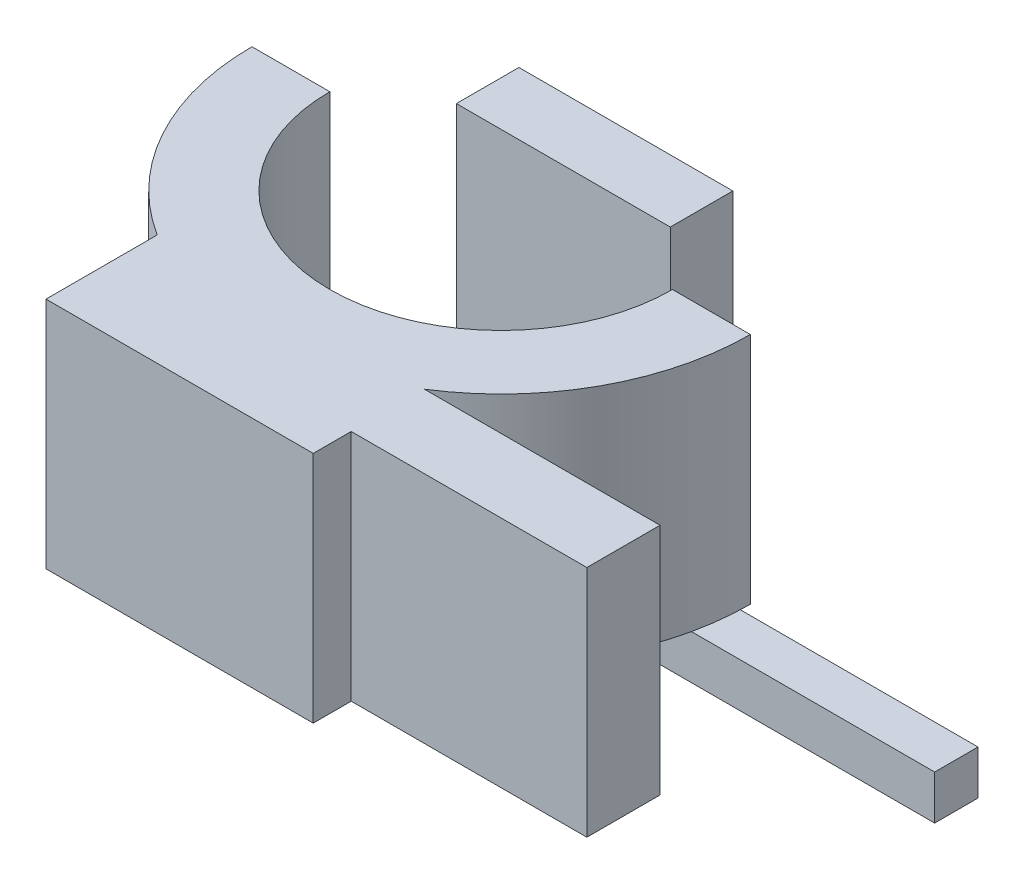
ISO-10303-21;
HEADER;
FILE_DESCRIPTION(('STEP AP214'),'2;1');
FILE_NAME('part.step','',(''),(''),'','','');
FILE_SCHEMA(('AUTOMOTIVE_DESIGN { 1 0 10303 214 1 1 1 1 }'));
ENDSEC;
DATA;
#1=APPLICATION_CONTEXT('core data for automotive mechanical design processes');
#2=APPLICATION_PROTOCOL_DEFINITION('international standard','automotive_design',2000,#1);
#3=PRODUCT_CONTEXT('',#1,'mechanical');
#4=PRODUCT('Part','Part','',(#3));
#5=PRODUCT_RELATED_PRODUCT_CATEGORY('part','',(#4));
#6=PRODUCT_DEFINITION_FORMATION('','',#4);
#7=PRODUCT_DEFINITION_CONTEXT('part definition',#1,'design');
#8=PRODUCT_DEFINITION('design','',#6,#7);
#9=PRODUCT_DEFINITION_SHAPE('','',#8);
#10=(LENGTH_UNIT() NAMED_UNIT(*) SI_UNIT(.MILLI.,.METRE.));
#11=(NAMED_UNIT(*) PLANE_ANGLE_UNIT() SI_UNIT($,.RADIAN.));
#12=(NAMED_UNIT(*) SI_UNIT($,.STERADIAN.) SOLID_ANGLE_UNIT());
#13=UNCERTAINTY_MEASURE_WITH_UNIT(LENGTH_MEASURE(1.E-05),#10,'distance_accuracy_value','');
#14=(GEOMETRIC_REPRESENTATION_CONTEXT(3) GLOBAL_UNCERTAINTY_ASSIGNED_CONTEXT((#13)) GLOBAL_UNIT_ASSIGNED_CONTEXT((#10,
#11,#12)) REPRESENTATION_CONTEXT('',''));
#15=CARTESIAN_POINT('',(0.,0.,0.));
#16=DIRECTION('',(0.,0.,1.));
#17=DIRECTION('',(1.,0.,0.));
#18=AXIS2_PLACEMENT_3D('',#15,#16,#17);
#19=CARTESIAN_POINT('',(2.77347256122325,-25.,-13.4602015658665));
#20=DIRECTION('',(-1.,0.,0.));
#21=DIRECTION('',(0.,0.,1.));
#22=AXIS2_PLACEMENT_3D('',#19,#20,#21);
#23=PLANE('',#22);
#24=DIRECTION('',(0.,0.,1.));
#25=VECTOR('',#24,1.);
#26=CARTESIAN_POINT('',(2.77347256122325,-19.3172173021132,-7.89287750827361));
#27=LINE('',#26,#25);
#28=CARTESIAN_POINT('',(2.77347256122325,-19.3172173021132,-13.4602015658665));
#29=VERTEX_POINT('',#28);
#30=CARTESIAN_POINT('',(2.77347256122325,-19.3172173021132,-7.89287750827361));
#31=VERTEX_POINT('',#30);
#32=EDGE_CURVE('E164',#29,#31,#27,.T.);
#33=ORIENTED_EDGE('',*,*,#32,.F.);
#34=DIRECTION('',(0.,1.,0.));
#35=VECTOR('',#34,1.);
#36=CARTESIAN_POINT('',(2.77347256122325,-25.,-13.4602015658665));
#37=LINE('',#36,#35);
#38=CARTESIAN_POINT('',(2.77347256122325,0.,-13.4602015658665));
#39=VERTEX_POINT('',#38);
#40=EDGE_CURVE('E177',#29,#39,#37,.T.);
#41=ORIENTED_EDGE('',*,*,#40,.T.);
#42=DIRECTION('',(0.,0.,1.));
#43=VECTOR('',#42,1.);
#44=CARTESIAN_POINT('',(2.77347256122325,0.,-13.4602015658665));
#45=LINE('',#44,#43);
#46=CARTESIAN_POINT('',(2.77347256122325,0.,-7.89287750827361));
#47=VERTEX_POINT('',#46);
#48=EDGE_CURVE('E173',#39,#47,#45,.T.);
#49=ORIENTED_EDGE('',*,*,#48,.T.);
#50=DIRECTION('',(0.,1.,0.));
#51=VECTOR('',#50,1.);
#52=CARTESIAN_POINT('',(2.77347256122325,-25.,-7.89287750827361));
#53=LINE('',#52,#51);
#54=EDGE_CURVE('E188',#31,#47,#53,.T.);
#55=ORIENTED_EDGE('',*,*,#54,.F.);
#56=EDGE_LOOP('',(#33,#41,#49,#55));
#57=FACE_BOUND('',#56,.T.);
#58=ADVANCED_FACE('F51',(#57),#23,.F.);
#59=CARTESIAN_POINT('',(0.,0.,0.));
#60=DIRECTION('',(0.,-1.,0.));
#61=DIRECTION('',(0.,0.,-1.));
#62=AXIS2_PLACEMENT_3D('',#59,#60,#61);
#63=PLANE('',#62);
#64=DIRECTION('',(1.,0.,0.));
#65=VECTOR('',#64,1.);
#66=CARTESIAN_POINT('',(14.910109148464,0.,-6.80646520609152));
#67=LINE('',#66,#65);
#68=CARTESIAN_POINT('',(-12.5555390868133,0.,-6.80646520609152));
#69=VERTEX_POINT('',#68);
#70=CARTESIAN_POINT('',(14.910109148464,0.,-6.80646520609152));
#71=VERTEX_POINT('',#70);
#72=EDGE_CURVE('E190',#69,#71,#67,.T.);
#73=ORIENTED_EDGE('',*,*,#72,.F.);
#74=DIRECTION('',(0.,0.,1.));
#75=VECTOR('',#74,1.);
#76=CARTESIAN_POINT('',(-12.5555390868133,0.,-6.80646520609152));
#77=LINE('',#76,#75);
#78=CARTESIAN_POINT('',(-12.5555390868133,0.,-14.8361542246356));
#79=VERTEX_POINT('',#78);
#80=EDGE_CURVE('E96',#79,#69,#77,.T.);
#81=ORIENTED_EDGE('',*,*,#80,.F.);
#82=DIRECTION('',(-1.,0.,0.));
#83=VECTOR('',#82,1.);
#84=CARTESIAN_POINT('',(-12.5555390868133,0.,-14.8361542246356));
#85=LINE('',#84,#83);
#86=CARTESIAN_POINT('',(14.910109148464,0.,-14.8361542246356));
#87=VERTEX_POINT('',#86);
#88=EDGE_CURVE('E202',#87,#79,#85,.T.);
#89=ORIENTED_EDGE('',*,*,#88,.F.);
#90=DIRECTION('',(0.,0.,-1.));
#91=VECTOR('',#90,1.);
#92=CARTESIAN_POINT('',(14.910109148464,0.,-14.8361542246356));
#93=LINE('',#92,#91);
#94=EDGE_CURVE('E200',#71,#87,#93,.T.);
#95=ORIENTED_EDGE('',*,*,#94,.F.);
#96=EDGE_LOOP('',(#73,#81,#89,#95));
#97=FACE_BOUND('',#96,.T.);
#98=DIRECTION('',(-1.,0.,0.));
#99=VECTOR('',#98,1.);
#100=CARTESIAN_POINT('',(2.77347256122325,0.,-7.89287750827361));
#101=LINE('',#100,#99);
#102=CARTESIAN_POINT('',(-2.04171345011078,0.,-7.89287750827361));
#103=VERTEX_POINT('',#102);
#104=EDGE_CURVE('E180',#47,#103,#101,.T.);
#105=ORIENTED_EDGE('',*,*,#104,.F.);
#106=ORIENTED_EDGE('',*,*,#48,.F.);
#107=DIRECTION('',(1.,0.,0.));
#108=VECTOR('',#107,1.);
#109=CARTESIAN_POINT('',(2.77347256122325,0.,-13.4602015658665));
#110=LINE('',#109,#108);
#111=CARTESIAN_POINT('',(-2.04171345011078,0.,-13.4602015658665));
#112=VERTEX_POINT('',#111);
#113=EDGE_CURVE('E150',#112,#39,#110,.T.);
#114=ORIENTED_EDGE('',*,*,#113,.F.);
#115=DIRECTION('',(0.,0.,-1.));
#116=VECTOR('',#115,1.);
#117=CARTESIAN_POINT('',(-2.04171345011078,0.,-13.4602015658665));
#118=LINE('',#117,#116);
#119=EDGE_CURVE('E182',#103,#112,#118,.T.);
#120=ORIENTED_EDGE('',*,*,#119,.F.);
#121=EDGE_LOOP('',(#105,#106,#114,#120));
#122=FACE_BOUND('',#121,.T.);
#123=ADVANCED_FACE('F215',(#97,#122),#63,.T.);
#124=CARTESIAN_POINT('',(14.910109148464,25.4,-6.80646520609152));
#125=DIRECTION('',(0.,0.,-1.));
#126=DIRECTION('',(-1.,0.,0.));
#127=AXIS2_PLACEMENT_3D('',#124,#125,#126);
#128=PLANE('',#127);
#129=ORIENTED_EDGE('',*,*,#72,.T.);
#130=DIRECTION('',(0.,-1.,0.));
#131=VECTOR('',#130,1.);
#132=CARTESIAN_POINT('',(14.910109148464,25.4,-6.80646520609152));
#133=LINE('',#132,#131);
#134=CARTESIAN_POINT('',(14.910109148464,25.4,-6.80646520609152));
#135=VERTEX_POINT('',#134);
#136=EDGE_CURVE('E12',#135,#71,#133,.T.);
#137=ORIENTED_EDGE('',*,*,#136,.F.);
#138=DIRECTION('',(1.,0.,0.));
#139=VECTOR('',#138,1.);
#140=CARTESIAN_POINT('',(14.910109148464,25.4,-6.80646520609152));
#141=LINE('',#140,#139);
#142=CARTESIAN_POINT('',(-12.5555390868133,25.4,-6.80646520609152));
#143=VERTEX_POINT('',#142);
#144=EDGE_CURVE('E191',#143,#135,#141,.T.);
#145=ORIENTED_EDGE('',*,*,#144,.F.);
#146=DIRECTION('',(0.,-1.,0.));
#147=VECTOR('',#146,1.);
#148=CARTESIAN_POINT('',(-12.5555390868133,25.4,-6.80646520609152));
#149=LINE('',#148,#147);
#150=EDGE_CURVE('E197',#143,#69,#149,.T.);
#151=ORIENTED_EDGE('',*,*,#150,.T.);
#152=EDGE_LOOP('',(#129,#137,#145,#151));
#153=FACE_BOUND('',#152,.T.);
#154=ADVANCED_FACE('F53',(#153),#128,.F.);
#155=CARTESIAN_POINT('',(14.910109148464,25.4,-14.8361542246356));
#156=DIRECTION('',(-1.,0.,0.));
#157=DIRECTION('',(0.,0.,1.));
#158=AXIS2_PLACEMENT_3D('',#155,#156,#157);
#159=PLANE('',#158);
#160=ORIENTED_EDGE('',*,*,#94,.T.);
#161=DIRECTION('',(0.,-1.,0.));
#162=VECTOR('',#161,1.);
#163=CARTESIAN_POINT('',(14.910109148464,25.4,-14.8361542246356));
#164=LINE('',#163,#162);
#165=CARTESIAN_POINT('',(14.910109148464,25.4,-14.8361542246356));
#166=VERTEX_POINT('',#165);
#167=EDGE_CURVE('E59',#166,#87,#164,.T.);
#168=ORIENTED_EDGE('',*,*,#167,.F.);
#169=DIRECTION('',(0.,0.,-1.));
#170=VECTOR('',#169,1.);
#171=CARTESIAN_POINT('',(14.910109148464,25.4,-14.8361542246356));
#172=LINE('',#171,#170);
#173=EDGE_CURVE('E103',#135,#166,#172,.T.);
#174=ORIENTED_EDGE('',*,*,#173,.F.);
#175=ORIENTED_EDGE('',*,*,#136,.T.);
#176=EDGE_LOOP('',(#160,#168,#174,#175));
#177=FACE_BOUND('',#176,.T.);
#178=ADVANCED_FACE('F229',(#177),#159,.F.);
#179=CARTESIAN_POINT('',(-12.5555390868133,25.4,-14.8361542246356));
#180=DIRECTION('',(0.,0.,1.));
#181=DIRECTION('',(1.,0.,0.));
#182=AXIS2_PLACEMENT_3D('',#179,#180,#181);
#183=PLANE('',#182);
#184=ORIENTED_EDGE('',*,*,#88,.T.);
#185=DIRECTION('',(0.,-1.,0.));
#186=VECTOR('',#185,1.);
#187=CARTESIAN_POINT('',(-12.5555390868133,25.4,-14.8361542246356));
#188=LINE('',#187,#186);
#189=CARTESIAN_POINT('',(-12.5555390868133,25.4,-14.8361542246356));
#190=VERTEX_POINT('',#189);
#191=EDGE_CURVE('E206',#190,#79,#188,.T.);
#192=ORIENTED_EDGE('',*,*,#191,.F.);
#193=DIRECTION('',(-1.,0.,0.));
#194=VECTOR('',#193,1.);
#195=CARTESIAN_POINT('',(-12.5555390868133,25.4,-14.8361542246356));
#196=LINE('',#195,#194);
#197=EDGE_CURVE('E194',#166,#190,#196,.T.);
#198=ORIENTED_EDGE('',*,*,#197,.F.);
#199=ORIENTED_EDGE('',*,*,#167,.T.);
#200=EDGE_LOOP('',(#184,#192,#198,#199));
#201=FACE_BOUND('',#200,.T.);
#202=ADVANCED_FACE('F211',(#201),#183,.F.);
#203=CARTESIAN_POINT('',(-12.5555390868133,25.4,-6.80646520609152));
#204=DIRECTION('',(1.,0.,0.));
#205=DIRECTION('',(0.,0.,-1.));
#206=AXIS2_PLACEMENT_3D('',#203,#204,#205);
#207=PLANE('',#206);
#208=ORIENTED_EDGE('',*,*,#80,.T.);
#209=ORIENTED_EDGE('',*,*,#150,.F.);
#210=DIRECTION('',(0.,0.,1.));
#211=VECTOR('',#210,1.);
#212=CARTESIAN_POINT('',(-12.5555390868133,25.4,-6.80646520609152));
#213=LINE('',#212,#211);
#214=EDGE_CURVE('E75',#190,#143,#213,.T.);
#215=ORIENTED_EDGE('',*,*,#214,.F.);
#216=ORIENTED_EDGE('',*,*,#191,.T.);
#217=EDGE_LOOP('',(#208,#209,#215,#216));
#218=FACE_BOUND('',#217,.T.);
#219=ADVANCED_FACE('F220',(#218),#207,.F.);
#220=CARTESIAN_POINT('',(0.,25.4,0.));
#221=DIRECTION('',(0.,-1.,0.));
#222=DIRECTION('',(0.,0.,-1.));
#223=AXIS2_PLACEMENT_3D('',#220,#221,#222);
#224=PLANE('',#223);
#225=ORIENTED_EDGE('',*,*,#144,.T.);
#226=ORIENTED_EDGE('',*,*,#173,.T.);
#227=ORIENTED_EDGE('',*,*,#197,.T.);
#228=ORIENTED_EDGE('',*,*,#214,.T.);
#229=EDGE_LOOP('',(#225,#226,#227,#228));
#230=FACE_BOUND('',#229,.T.);
#231=ADVANCED_FACE('F222',(#230),#224,.F.);
#232=CARTESIAN_POINT('',(2.77347256122325,-25.,-7.89287750827361));
#233=DIRECTION('',(0.,0.,-1.));
#234=DIRECTION('',(-1.,0.,0.));
#235=AXIS2_PLACEMENT_3D('',#232,#233,#234);
#236=PLANE('',#235);
#237=ORIENTED_EDGE('',*,*,#104,.T.);
#238=DIRECTION('',(0.,1.,0.));
#239=VECTOR('',#238,1.);
#240=CARTESIAN_POINT('',(-2.04171345011078,-25.,-7.89287750827361));
#241=LINE('',#240,#239);
#242=CARTESIAN_POINT('',(-2.04171345011078,-25.,-7.89287750827361));
#243=VERTEX_POINT('',#242);
#244=EDGE_CURVE('E146',#243,#103,#241,.T.);
#245=ORIENTED_EDGE('',*,*,#244,.F.);
#246=DIRECTION('',(-1.,0.,0.));
#247=VECTOR('',#246,1.);
#248=CARTESIAN_POINT('',(2.77347256122325,-25.,-7.89287750827361));
#249=LINE('',#248,#247);
#250=CARTESIAN_POINT('',(47.7734725612233,-25.,-7.89287750827361));
#251=VERTEX_POINT('',#250);
#252=EDGE_CURVE('E139',#251,#243,#249,.T.);
#253=ORIENTED_EDGE('',*,*,#252,.F.);
#254=DIRECTION('',(0.,-1.,0.));
#255=VECTOR('',#254,1.);
#256=CARTESIAN_POINT('',(47.7734725612233,-19.3172173021132,-7.89287750827361));
#257=LINE('',#256,#255);
#258=CARTESIAN_POINT('',(47.7734725612233,-19.3172173021132,-7.89287750827361));
#259=VERTEX_POINT('',#258);
#260=EDGE_CURVE('E144',#259,#251,#257,.T.);
#261=ORIENTED_EDGE('',*,*,#260,.F.);
#262=DIRECTION('',(-1.,0.,0.));
#263=VECTOR('',#262,1.);
#264=CARTESIAN_POINT('',(47.7734725612233,-19.3172173021132,-7.89287750827361));
#265=LINE('',#264,#263);
#266=EDGE_CURVE('E169',#259,#31,#265,.T.);
#267=ORIENTED_EDGE('',*,*,#266,.T.);
#268=ORIENTED_EDGE('',*,*,#54,.T.);
#269=EDGE_LOOP('',(#237,#245,#253,#261,#267,#268));
#270=FACE_BOUND('',#269,.T.);
#271=ADVANCED_FACE('F141',(#270),#236,.F.);
#272=CARTESIAN_POINT('',(-2.04171345011078,-25.,-13.4602015658665));
#273=DIRECTION('',(1.,0.,0.));
#274=DIRECTION('',(0.,0.,-1.));
#275=AXIS2_PLACEMENT_3D('',#272,#273,#274);
#276=PLANE('',#275);
#277=ORIENTED_EDGE('',*,*,#119,.T.);
#278=DIRECTION('',(0.,1.,0.));
#279=VECTOR('',#278,1.);
#280=CARTESIAN_POINT('',(-2.04171345011078,-25.,-13.4602015658665));
#281=LINE('',#280,#279);
#282=CARTESIAN_POINT('',(-2.04171345011078,-25.,-13.4602015658665));
#283=VERTEX_POINT('',#282);
#284=EDGE_CURVE('E66',#283,#112,#281,.T.);
#285=ORIENTED_EDGE('',*,*,#284,.F.);
#286=DIRECTION('',(0.,0.,-1.));
#287=VECTOR('',#286,1.);
#288=CARTESIAN_POINT('',(-2.04171345011078,-25.,-13.4602015658665));
#289=LINE('',#288,#287);
#290=EDGE_CURVE('E149',#243,#283,#289,.T.);
#291=ORIENTED_EDGE('',*,*,#290,.F.);
#292=ORIENTED_EDGE('',*,*,#244,.T.);
#293=EDGE_LOOP('',(#277,#285,#291,#292));
#294=FACE_BOUND('',#293,.T.);
#295=ADVANCED_FACE('F242',(#294),#276,.F.);
#296=CARTESIAN_POINT('',(2.77347256122325,-25.,-13.4602015658665));
#297=DIRECTION('',(0.,0.,1.));
#298=DIRECTION('',(1.,0.,0.));
#299=AXIS2_PLACEMENT_3D('',#296,#297,#298);
#300=PLANE('',#299);
#301=ORIENTED_EDGE('',*,*,#113,.T.);
#302=ORIENTED_EDGE('',*,*,#40,.F.);
#303=DIRECTION('',(-1.,0.,0.));
#304=VECTOR('',#303,1.);
#305=CARTESIAN_POINT('',(47.7734725612233,-19.3172173021132,-13.4602015658665));
#306=LINE('',#305,#304);
#307=CARTESIAN_POINT('',(47.7734725612233,-19.3172173021132,-13.4602015658665));
#308=VERTEX_POINT('',#307);
#309=EDGE_CURVE('E172',#308,#29,#306,.T.);
#310=ORIENTED_EDGE('',*,*,#309,.F.);
#311=DIRECTION('',(0.,1.,0.));
#312=VECTOR('',#311,1.);
#313=CARTESIAN_POINT('',(47.7734725612233,-19.3172173021132,-13.4602015658665));
#314=LINE('',#313,#312);
#315=CARTESIAN_POINT('',(47.7734725612233,-25.,-13.4602015658665));
#316=VERTEX_POINT('',#315);
#317=EDGE_CURVE('E158',#316,#308,#314,.T.);
#318=ORIENTED_EDGE('',*,*,#317,.F.);
#319=DIRECTION('',(1.,0.,0.));
#320=VECTOR('',#319,1.);
#321=CARTESIAN_POINT('',(2.77347256122325,-25.,-13.4602015658665));
#322=LINE('',#321,#320);
#323=EDGE_CURVE('E155',#283,#316,#322,.T.);
#324=ORIENTED_EDGE('',*,*,#323,.F.);
#325=ORIENTED_EDGE('',*,*,#284,.T.);
#326=EDGE_LOOP('',(#301,#302,#310,#318,#324,#325));
#327=FACE_BOUND('',#326,.T.);
#328=ADVANCED_FACE('F245',(#327),#300,.F.);
#329=CARTESIAN_POINT('',(0.,-25.,0.));
#330=DIRECTION('',(0.,-1.,0.));
#331=DIRECTION('',(0.,0.,-1.));
#332=AXIS2_PLACEMENT_3D('',#329,#330,#331);
#333=PLANE('',#332);
#334=ORIENTED_EDGE('',*,*,#323,.T.);
#335=DIRECTION('',(0.,0.,-1.));
#336=VECTOR('',#335,1.);
#337=CARTESIAN_POINT('',(47.7734725612233,-25.,-7.89287750827361));
#338=LINE('',#337,#336);
#339=EDGE_CURVE('E153',#251,#316,#338,.T.);
#340=ORIENTED_EDGE('',*,*,#339,.F.);
#341=ORIENTED_EDGE('',*,*,#252,.T.);
#342=ORIENTED_EDGE('',*,*,#290,.T.);
#343=EDGE_LOOP('',(#334,#340,#341,#342));
#344=FACE_BOUND('',#343,.T.);
#345=ADVANCED_FACE('F154',(#344),#333,.T.);
#346=CARTESIAN_POINT('',(47.7734725612233,-19.3172173021132,-7.89287750827361));
#347=DIRECTION('',(0.,-1.,0.));
#348=DIRECTION('',(0.,0.,-1.));
#349=AXIS2_PLACEMENT_3D('',#346,#347,#348);
#350=PLANE('',#349);
#351=ORIENTED_EDGE('',*,*,#32,.T.);
#352=ORIENTED_EDGE('',*,*,#266,.F.);
#353=DIRECTION('',(0.,0.,1.));
#354=VECTOR('',#353,1.);
#355=CARTESIAN_POINT('',(47.7734725612233,-19.3172173021132,-7.89287750827361));
#356=LINE('',#355,#354);
#357=EDGE_CURVE('E162',#308,#259,#356,.T.);
#358=ORIENTED_EDGE('',*,*,#357,.F.);
#359=ORIENTED_EDGE('',*,*,#309,.T.);
#360=EDGE_LOOP('',(#351,#352,#358,#359));
#361=FACE_BOUND('',#360,.T.);
#362=ADVANCED_FACE('F251',(#361),#350,.F.);
#363=CARTESIAN_POINT('',(47.7734725612233,0.,0.));
#364=DIRECTION('',(1.,0.,0.));
#365=DIRECTION('',(0.,0.,-1.));
#366=AXIS2_PLACEMENT_3D('',#363,#364,#365);
#367=PLANE('',#366);
#368=ORIENTED_EDGE('',*,*,#260,.T.);
#369=ORIENTED_EDGE('',*,*,#339,.T.);
#370=ORIENTED_EDGE('',*,*,#317,.T.);
#371=ORIENTED_EDGE('',*,*,#357,.T.);
#372=EDGE_LOOP('',(#368,#369,#370,#371));
#373=FACE_BOUND('',#372,.T.);
#374=ADVANCED_FACE('F160',(#373),#367,.T.);
#375=CLOSED_SHELL('',(#58,#123,#154,#178,#202,#219,#231,#271,#295,#328,#345,#362,#374));
#376=MANIFOLD_SOLID_BREP('B2',#375);
#377=CARTESIAN_POINT('',(17.1577520725218,-4.6,27.0113225114557));
#378=DIRECTION('',(0.,0.,-1.));
#379=DIRECTION('',(-1.,0.,0.));
#380=AXIS2_PLACEMENT_3D('',#377,#378,#379);
#381=PLANE('',#380);
#382=DIRECTION('',(-1.,0.,0.));
#383=VECTOR('',#382,1.);
#384=CARTESIAN_POINT('',(17.1577520725218,25.4,27.0113225114557));
#385=LINE('',#384,#383);
#386=CARTESIAN_POINT('',(47.4163432015793,25.4,27.0113225114557));
#387=VERTEX_POINT('',#386);
#388=CARTESIAN_POINT('',(17.1577520725218,25.4,27.0113225114557));
#389=VERTEX_POINT('',#388);
#390=EDGE_CURVE('E461',#387,#389,#385,.T.);
#391=ORIENTED_EDGE('',*,*,#390,.F.);
#392=DIRECTION('',(0.,1.,0.));
#393=VECTOR('',#392,1.);
#394=CARTESIAN_POINT('',(47.4163432015793,-4.6,27.0113225114557));
#395=LINE('',#394,#393);
#396=CARTESIAN_POINT('',(47.4163432015793,-4.6,27.0113225114557));
#397=VERTEX_POINT('',#396);
#398=EDGE_CURVE('E515',#397,#387,#395,.T.);
#399=ORIENTED_EDGE('',*,*,#398,.F.);
#400=DIRECTION('',(-1.,0.,0.));
#401=VECTOR('',#400,1.);
#402=CARTESIAN_POINT('',(37.1577520725218,-4.6,27.0113225114557));
#403=LINE('',#402,#401);
#404=CARTESIAN_POINT('',(17.1577520725218,-4.6,27.0113225114557));
#405=VERTEX_POINT('',#404);
#406=EDGE_CURVE('E496',#397,#405,#403,.T.);
#407=ORIENTED_EDGE('',*,*,#406,.T.);
#408=DIRECTION('',(0.,-1.,0.));
#409=VECTOR('',#408,1.);
#410=CARTESIAN_POINT('',(17.1577520725218,25.4,27.0113225114557));
#411=LINE('',#410,#409);
#412=EDGE_CURVE('E360',#389,#405,#411,.T.);
#413=ORIENTED_EDGE('',*,*,#412,.F.);
#414=EDGE_LOOP('',(#391,#399,#407,#413));
#415=FACE_BOUND('',#414,.T.);
#416=ADVANCED_FACE('F351',(#415),#381,.T.);
#417=CARTESIAN_POINT('',(47.4163432015793,-4.6,27.0113225114557));
#418=DIRECTION('',(1.,0.,0.));
#419=DIRECTION('',(0.,0.,-1.));
#420=AXIS2_PLACEMENT_3D('',#417,#418,#419);
#421=PLANE('',#420);
#422=DIRECTION('',(0.,0.,-1.));
#423=VECTOR('',#422,1.);
#424=CARTESIAN_POINT('',(47.4163432015793,25.4,27.0113225114557));
#425=LINE('',#424,#423);
#426=CARTESIAN_POINT('',(47.4163432015793,25.4,36.4107033997451));
#427=VERTEX_POINT('',#426);
#428=EDGE_CURVE('E465',#427,#387,#425,.T.);
#429=ORIENTED_EDGE('',*,*,#428,.F.);
#430=DIRECTION('',(0.,1.,0.));
#431=VECTOR('',#430,1.);
#432=CARTESIAN_POINT('',(47.4163432015793,-4.6,36.4107033997451));
#433=LINE('',#432,#431);
#434=CARTESIAN_POINT('',(47.4163432015793,-4.6,36.4107033997451));
#435=VERTEX_POINT('',#434);
#436=EDGE_CURVE('E520',#435,#427,#433,.T.);
#437=ORIENTED_EDGE('',*,*,#436,.F.);
#438=DIRECTION('',(0.,0.,-1.));
#439=VECTOR('',#438,1.);
#440=CARTESIAN_POINT('',(47.4163432015793,-4.6,33.1142494500849));
#441=LINE('',#440,#439);
#442=EDGE_CURVE('E493',#435,#397,#441,.T.);
#443=ORIENTED_EDGE('',*,*,#442,.T.);
#444=ORIENTED_EDGE('',*,*,#398,.T.);
#445=EDGE_LOOP('',(#429,#437,#443,#444));
#446=FACE_BOUND('',#445,.T.);
#447=ADVANCED_FACE('F582',(#446),#421,.T.);
#448=CARTESIAN_POINT('',(47.4163432015793,-4.6,36.4107033997451));
#449=DIRECTION('',(0.,0.,1.));
#450=DIRECTION('',(1.,0.,0.));
#451=AXIS2_PLACEMENT_3D('',#448,#449,#450);
#452=PLANE('',#451);
#453=DIRECTION('',(1.,0.,0.));
#454=VECTOR('',#453,1.);
#455=CARTESIAN_POINT('',(47.4163432015793,25.4,36.4107033997451));
#456=LINE('',#455,#454);
#457=CARTESIAN_POINT('',(17.1577520725218,25.4,36.4107033997451));
#458=VERTEX_POINT('',#457);
#459=EDGE_CURVE('E508',#458,#427,#456,.T.);
#460=ORIENTED_EDGE('',*,*,#459,.F.);
#461=DIRECTION('',(0.,1.,0.));
#462=VECTOR('',#461,1.);
#463=CARTESIAN_POINT('',(17.1577520725218,-4.6,36.4107033997451));
#464=LINE('',#463,#462);
#465=CARTESIAN_POINT('',(17.1577520725218,-4.6,36.4107033997451));
#466=VERTEX_POINT('',#465);
#467=EDGE_CURVE('E524',#466,#458,#464,.T.);
#468=ORIENTED_EDGE('',*,*,#467,.F.);
#469=DIRECTION('',(1.,0.,0.));
#470=VECTOR('',#469,1.);
#471=CARTESIAN_POINT('',(47.4163432015793,-4.6,36.4107033997451));
#472=LINE('',#471,#470);
#473=EDGE_CURVE('E489',#466,#435,#472,.T.);
#474=ORIENTED_EDGE('',*,*,#473,.T.);
#475=ORIENTED_EDGE('',*,*,#436,.T.);
#476=EDGE_LOOP('',(#460,#468,#474,#475));
#477=FACE_BOUND('',#476,.T.);
#478=ADVANCED_FACE('F578',(#477),#452,.T.);
#479=CARTESIAN_POINT('',(17.1577520725218,-4.6,36.4107033997451));
#480=DIRECTION('',(1.,0.,0.));
#481=DIRECTION('',(0.,0.,-1.));
#482=AXIS2_PLACEMENT_3D('',#479,#480,#481);
#483=PLANE('',#482);
#484=DIRECTION('',(0.,0.,-1.));
#485=VECTOR('',#484,1.);
#486=CARTESIAN_POINT('',(17.1577520725218,25.4,36.4107033997451));
#487=LINE('',#486,#485);
#488=CARTESIAN_POINT('',(17.1577520725218,25.4,41.2897292263779));
#489=VERTEX_POINT('',#488);
#490=EDGE_CURVE('E504',#489,#458,#487,.T.);
#491=ORIENTED_EDGE('',*,*,#490,.F.);
#492=DIRECTION('',(0.,1.,0.));
#493=VECTOR('',#492,1.);
#494=CARTESIAN_POINT('',(17.1577520725218,-4.6,41.2897292263779));
#495=LINE('',#494,#493);
#496=CARTESIAN_POINT('',(17.1577520725218,-4.6,41.2897292263779));
#497=VERTEX_POINT('',#496);
#498=EDGE_CURVE('E527',#497,#489,#495,.T.);
#499=ORIENTED_EDGE('',*,*,#498,.F.);
#500=DIRECTION('',(0.,0.,-1.));
#501=VECTOR('',#500,1.);
#502=CARTESIAN_POINT('',(17.1577520725218,-4.6,36.4107033997451));
#503=LINE('',#502,#501);
#504=EDGE_CURVE('E485',#497,#466,#503,.T.);
#505=ORIENTED_EDGE('',*,*,#504,.T.);
#506=ORIENTED_EDGE('',*,*,#467,.T.);
#507=EDGE_LOOP('',(#491,#499,#505,#506));
#508=FACE_BOUND('',#507,.T.);
#509=ADVANCED_FACE('F575',(#508),#483,.T.);
#510=CARTESIAN_POINT('',(-17.1577520725218,-4.6,41.2897292263779));
#511=DIRECTION('',(0.,0.,1.));
#512=DIRECTION('',(1.,0.,0.));
#513=AXIS2_PLACEMENT_3D('',#510,#511,#512);
#514=PLANE('',#513);
#515=DIRECTION('',(1.,0.,0.));
#516=VECTOR('',#515,1.);
#517=CARTESIAN_POINT('',(-17.1577520725218,25.4,41.2897292263779));
#518=LINE('',#517,#516);
#519=CARTESIAN_POINT('',(-17.1577520725218,25.4,41.2897292263779));
#520=VERTEX_POINT('',#519);
#521=EDGE_CURVE('E500',#520,#489,#518,.T.);
#522=ORIENTED_EDGE('',*,*,#521,.F.);
#523=DIRECTION('',(0.,1.,0.));
#524=VECTOR('',#523,1.);
#525=CARTESIAN_POINT('',(-17.1577520725218,-4.6,41.2897292263779));
#526=LINE('',#525,#524);
#527=CARTESIAN_POINT('',(-17.1577520725218,-4.6,41.2897292263779));
#528=VERTEX_POINT('',#527);
#529=EDGE_CURVE('E499',#528,#520,#526,.T.);
#530=ORIENTED_EDGE('',*,*,#529,.F.);
#531=DIRECTION('',(1.,0.,0.));
#532=VECTOR('',#531,1.);
#533=CARTESIAN_POINT('',(-17.1577520725218,-4.6,41.2897292263779));
#534=LINE('',#533,#532);
#535=EDGE_CURVE('E481',#528,#497,#534,.T.);
#536=ORIENTED_EDGE('',*,*,#535,.T.);
#537=ORIENTED_EDGE('',*,*,#498,.T.);
#538=EDGE_LOOP('',(#522,#530,#536,#537));
#539=FACE_BOUND('',#538,.T.);
#540=ADVANCED_FACE('F571',(#539),#514,.T.);
#541=CARTESIAN_POINT('',(0.,-4.6,0.));
#542=DIRECTION('',(0.,1.,0.));
#543=DIRECTION('',(0.,0.,1.));
#544=AXIS2_PLACEMENT_3D('',#541,#542,#543);
#545=PLANE('',#544);
#546=CARTESIAN_POINT('',(0.,-4.6,0.));
#547=DIRECTION('',(0.,1.,0.));
#548=DIRECTION('',(0.,0.,1.));
#549=AXIS2_PLACEMENT_3D('',#546,#547,#548);
#550=CIRCLE('',#549,32.);
#551=CARTESIAN_POINT('',(32.,-4.6,0.));
#552=VERTEX_POINT('',#551);
#553=EDGE_CURVE('E452',#405,#552,#550,.T.);
#554=ORIENTED_EDGE('',*,*,#553,.F.);
#555=ORIENTED_EDGE('',*,*,#406,.F.);
#556=ORIENTED_EDGE('',*,*,#442,.F.);
#557=ORIENTED_EDGE('',*,*,#473,.F.);
#558=ORIENTED_EDGE('',*,*,#504,.F.);
#559=ORIENTED_EDGE('',*,*,#535,.F.);
#560=DIRECTION('',(0.,0.,1.));
#561=VECTOR('',#560,1.);
#562=CARTESIAN_POINT('',(-17.1577520725218,-4.6,27.0113225114557));
#563=LINE('',#562,#561);
#564=CARTESIAN_POINT('',(-17.1577520725218,-4.6,27.0113225114557));
#565=VERTEX_POINT('',#564);
#566=EDGE_CURVE('E478',#565,#528,#563,.T.);
#567=ORIENTED_EDGE('',*,*,#566,.F.);
#568=CARTESIAN_POINT('',(0.,-4.6,0.));
#569=DIRECTION('',(0.,1.,0.));
#570=DIRECTION('',(0.,0.,1.));
#571=AXIS2_PLACEMENT_3D('',#568,#569,#570);
#572=CIRCLE('',#571,32.);
#573=CARTESIAN_POINT('',(-32.,-4.6,0.));
#574=VERTEX_POINT('',#573);
#575=EDGE_CURVE('E474',#574,#565,#572,.T.);
#576=ORIENTED_EDGE('',*,*,#575,.F.);
#577=DIRECTION('',(-1.,0.,0.));
#578=VECTOR('',#577,1.);
#579=CARTESIAN_POINT('',(-22.,-4.6,0.));
#580=LINE('',#579,#578);
#581=CARTESIAN_POINT('',(-22.,-4.6,0.));
#582=VERTEX_POINT('',#581);
#583=EDGE_CURVE('E470',#582,#574,#580,.T.);
#584=ORIENTED_EDGE('',*,*,#583,.F.);
#585=CARTESIAN_POINT('',(0.,-4.6,0.));
#586=DIRECTION('',(0.,-1.,0.));
#587=DIRECTION('',(0.,0.,1.));
#588=AXIS2_PLACEMENT_3D('',#585,#586,#587);
#589=CIRCLE('',#588,22.);
#590=CARTESIAN_POINT('',(22.,-4.6,0.));
#591=VERTEX_POINT('',#590);
#592=EDGE_CURVE('E455',#591,#582,#589,.T.);
#593=ORIENTED_EDGE('',*,*,#592,.F.);
#594=DIRECTION('',(-1.,0.,0.));
#595=VECTOR('',#594,1.);
#596=CARTESIAN_POINT('',(32.,-4.6,0.));
#597=LINE('',#596,#595);
#598=EDGE_CURVE('E439',#552,#591,#597,.T.);
#599=ORIENTED_EDGE('',*,*,#598,.F.);
#600=EDGE_LOOP('',(#554,#555,#556,#557,#558,#559,#567,#576,#584,#593,#599));
#601=FACE_BOUND('',#600,.T.);
#602=ADVANCED_FACE('F450',(#601),#545,.F.);
#603=CARTESIAN_POINT('',(0.,25.4,0.));
#604=DIRECTION('',(0.,-1.,0.));
#605=DIRECTION('',(0.,0.,-1.));
#606=AXIS2_PLACEMENT_3D('',#603,#604,#605);
#607=CYLINDRICAL_SURFACE('',#606,32.);
#608=DIRECTION('',(0.,-1.,0.));
#609=VECTOR('',#608,1.);
#610=CARTESIAN_POINT('',(-32.,25.4,0.));
#611=LINE('',#610,#609);
#612=CARTESIAN_POINT('',(-32.,25.4,0.));
#613=VERTEX_POINT('',#612);
#614=EDGE_CURVE('E547',#613,#574,#611,.T.);
#615=ORIENTED_EDGE('',*,*,#614,.T.);
#616=ORIENTED_EDGE('',*,*,#575,.T.);
#617=DIRECTION('',(0.,-1.,0.));
#618=VECTOR('',#617,1.);
#619=CARTESIAN_POINT('',(-17.1577520725218,25.4,27.0113225114557));
#620=LINE('',#619,#618);
#621=CARTESIAN_POINT('',(-17.1577520725218,25.4,27.0113225114557));
#622=VERTEX_POINT('',#621);
#623=EDGE_CURVE('E49',#622,#565,#620,.T.);
#624=ORIENTED_EDGE('',*,*,#623,.F.);
#625=CARTESIAN_POINT('',(0.,25.4,0.));
#626=DIRECTION('',(0.,1.,0.));
#627=DIRECTION('',(0.,0.,1.));
#628=AXIS2_PLACEMENT_3D('',#625,#626,#627);
#629=CIRCLE('',#628,32.);
#630=EDGE_CURVE('E519',#613,#622,#629,.T.);
#631=ORIENTED_EDGE('',*,*,#630,.F.);
#632=EDGE_LOOP('',(#615,#616,#624,#631));
#633=FACE_BOUND('',#632,.T.);
#634=ADVANCED_FACE('F353',(#633),#607,.T.);
#635=CARTESIAN_POINT('',(-17.1577520725218,25.4,27.0113225114557));
#636=DIRECTION('',(1.,0.,0.));
#637=DIRECTION('',(0.,0.,-1.));
#638=AXIS2_PLACEMENT_3D('',#635,#636,#637);
#639=PLANE('',#638);
#640=ORIENTED_EDGE('',*,*,#623,.T.);
#641=ORIENTED_EDGE('',*,*,#566,.T.);
#642=ORIENTED_EDGE('',*,*,#529,.T.);
#643=DIRECTION('',(0.,0.,1.));
#644=VECTOR('',#643,1.);
#645=CARTESIAN_POINT('',(-17.1577520725218,25.4,27.0113225114557));
#646=LINE('',#645,#644);
#647=EDGE_CURVE('E535',#622,#520,#646,.T.);
#648=ORIENTED_EDGE('',*,*,#647,.F.);
#649=EDGE_LOOP('',(#640,#641,#642,#648));
#650=FACE_BOUND('',#649,.T.);
#651=ADVANCED_FACE('F567',(#650),#639,.F.);
#652=CARTESIAN_POINT('',(0.,25.4,0.));
#653=DIRECTION('',(0.,-1.,0.));
#654=DIRECTION('',(0.,0.,-1.));
#655=AXIS2_PLACEMENT_3D('',#652,#653,#654);
#656=CYLINDRICAL_SURFACE('',#655,32.);
#657=ORIENTED_EDGE('',*,*,#412,.T.);
#658=ORIENTED_EDGE('',*,*,#553,.T.);
#659=DIRECTION('',(0.,-1.,0.));
#660=VECTOR('',#659,1.);
#661=CARTESIAN_POINT('',(32.,25.4,0.));
#662=LINE('',#661,#660);
#663=CARTESIAN_POINT('',(32.,25.4,0.));
#664=VERTEX_POINT('',#663);
#665=EDGE_CURVE('E435',#664,#552,#662,.T.);
#666=ORIENTED_EDGE('',*,*,#665,.F.);
#667=CARTESIAN_POINT('',(0.,25.4,0.));
#668=DIRECTION('',(0.,1.,0.));
#669=DIRECTION('',(0.,0.,1.));
#670=AXIS2_PLACEMENT_3D('',#667,#668,#669);
#671=CIRCLE('',#670,32.);
#672=EDGE_CURVE('E538',#389,#664,#671,.T.);
#673=ORIENTED_EDGE('',*,*,#672,.F.);
#674=EDGE_LOOP('',(#657,#658,#666,#673));
#675=FACE_BOUND('',#674,.T.);
#676=ADVANCED_FACE('F458',(#675),#656,.T.);
#677=CARTESIAN_POINT('',(22.,25.4,0.));
#678=DIRECTION('',(0.,0.,1.));
#679=DIRECTION('',(1.,0.,0.));
#680=AXIS2_PLACEMENT_3D('',#677,#678,#679);
#681=PLANE('',#680);
#682=ORIENTED_EDGE('',*,*,#665,.T.);
#683=ORIENTED_EDGE('',*,*,#598,.T.);
#684=DIRECTION('',(0.,-1.,0.));
#685=VECTOR('',#684,1.);
#686=CARTESIAN_POINT('',(22.,25.4,0.));
#687=LINE('',#686,#685);
#688=CARTESIAN_POINT('',(22.,25.4,0.));
#689=VERTEX_POINT('',#688);
#690=EDGE_CURVE('E445',#689,#591,#687,.T.);
#691=ORIENTED_EDGE('',*,*,#690,.F.);
#692=DIRECTION('',(-1.,0.,0.));
#693=VECTOR('',#692,1.);
#694=CARTESIAN_POINT('',(22.,25.4,0.));
#695=LINE('',#694,#693);
#696=EDGE_CURVE('E440',#664,#689,#695,.T.);
#697=ORIENTED_EDGE('',*,*,#696,.F.);
#698=EDGE_LOOP('',(#682,#683,#691,#697));
#699=FACE_BOUND('',#698,.T.);
#700=ADVANCED_FACE('F437',(#699),#681,.F.);
#701=CARTESIAN_POINT('',(0.,25.4,0.));
#702=DIRECTION('',(0.,-1.,0.));
#703=DIRECTION('',(0.,0.,-1.));
#704=AXIS2_PLACEMENT_3D('',#701,#702,#703);
#705=CYLINDRICAL_SURFACE('',#704,22.);
#706=ORIENTED_EDGE('',*,*,#690,.T.);
#707=ORIENTED_EDGE('',*,*,#592,.T.);
#708=DIRECTION('',(0.,-1.,0.));
#709=VECTOR('',#708,1.);
#710=CARTESIAN_POINT('',(-22.,25.4,0.));
#711=LINE('',#710,#709);
#712=CARTESIAN_POINT('',(-22.,25.4,0.));
#713=VERTEX_POINT('',#712);
#714=EDGE_CURVE('E550',#713,#582,#711,.T.);
#715=ORIENTED_EDGE('',*,*,#714,.F.);
#716=CARTESIAN_POINT('',(0.,25.4,0.));
#717=DIRECTION('',(0.,-1.,0.));
#718=DIRECTION('',(0.,0.,1.));
#719=AXIS2_PLACEMENT_3D('',#716,#717,#718);
#720=CIRCLE('',#719,22.);
#721=EDGE_CURVE('E372',#689,#713,#720,.T.);
#722=ORIENTED_EDGE('',*,*,#721,.F.);
#723=EDGE_LOOP('',(#706,#707,#715,#722));
#724=FACE_BOUND('',#723,.T.);
#725=ADVANCED_FACE('F556',(#724),#705,.F.);
#726=CARTESIAN_POINT('',(-32.,25.4,0.));
#727=DIRECTION('',(0.,0.,1.));
#728=DIRECTION('',(1.,0.,0.));
#729=AXIS2_PLACEMENT_3D('',#726,#727,#728);
#730=PLANE('',#729);
#731=ORIENTED_EDGE('',*,*,#714,.T.);
#732=ORIENTED_EDGE('',*,*,#583,.T.);
#733=ORIENTED_EDGE('',*,*,#614,.F.);
#734=DIRECTION('',(-1.,0.,0.));
#735=VECTOR('',#734,1.);
#736=CARTESIAN_POINT('',(-32.,25.4,0.));
#737=LINE('',#736,#735);
#738=EDGE_CURVE('E367',#713,#613,#737,.T.);
#739=ORIENTED_EDGE('',*,*,#738,.F.);
#740=EDGE_LOOP('',(#731,#732,#733,#739));
#741=FACE_BOUND('',#740,.T.);
#742=ADVANCED_FACE('F558',(#741),#730,.F.);
#743=CARTESIAN_POINT('',(0.,25.4,0.));
#744=DIRECTION('',(0.,1.,0.));
#745=DIRECTION('',(0.,0.,1.));
#746=AXIS2_PLACEMENT_3D('',#743,#744,#745);
#747=PLANE('',#746);
#748=ORIENTED_EDGE('',*,*,#630,.T.);
#749=ORIENTED_EDGE('',*,*,#647,.T.);
#750=ORIENTED_EDGE('',*,*,#521,.T.);
#751=ORIENTED_EDGE('',*,*,#490,.T.);
#752=ORIENTED_EDGE('',*,*,#459,.T.);
#753=ORIENTED_EDGE('',*,*,#428,.T.);
#754=ORIENTED_EDGE('',*,*,#390,.T.);
#755=ORIENTED_EDGE('',*,*,#672,.T.);
#756=ORIENTED_EDGE('',*,*,#696,.T.);
#757=ORIENTED_EDGE('',*,*,#721,.T.);
#758=ORIENTED_EDGE('',*,*,#738,.T.);
#759=EDGE_LOOP('',(#748,#749,#750,#751,#752,#753,#754,#755,#756,#757,#758));
#760=FACE_BOUND('',#759,.T.);
#761=ADVANCED_FACE('F563',(#760),#747,.T.);
#762=CLOSED_SHELL('',(#416,#447,#478,#509,#540,#602,#634,#651,#676,#700,#725,#742,#761));
#763=MANIFOLD_SOLID_BREP('B6',#762);
#764=ADVANCED_BREP_SHAPE_REPRESENTATION('',(#18,#376,#763),#14);
#765=SHAPE_DEFINITION_REPRESENTATION(#9,#764);
ENDSEC;
END-ISO-10303-21;
